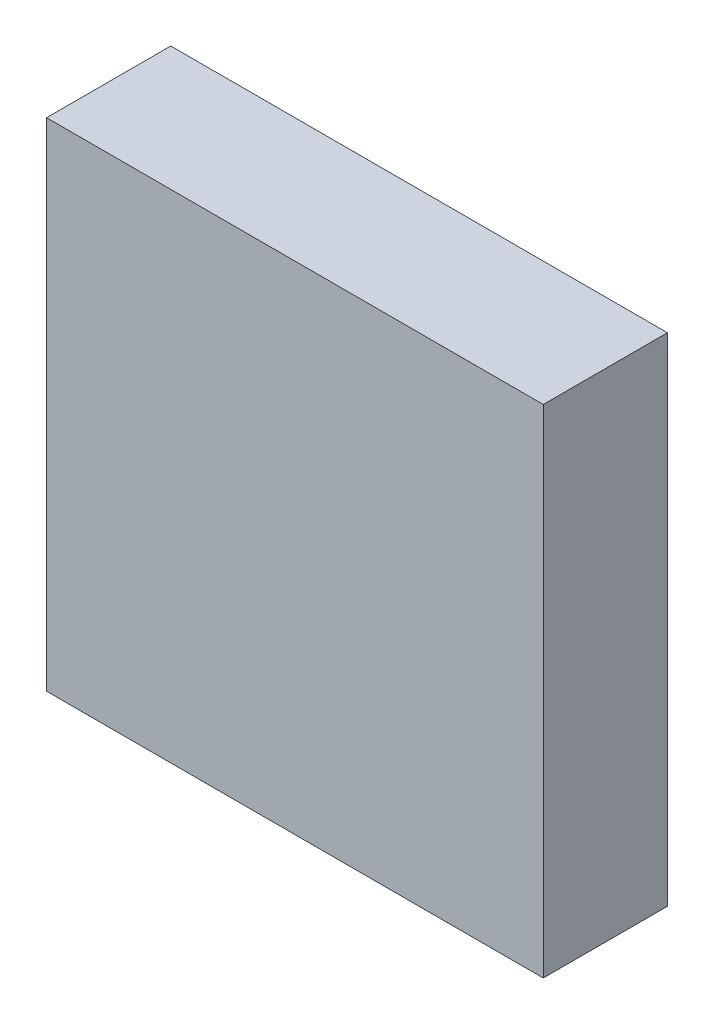
ISO-10303-21;
HEADER;
FILE_DESCRIPTION(('STEP AP214'),'2;1');
FILE_NAME('part.step','',(''),(''),'','','');
FILE_SCHEMA(('AUTOMOTIVE_DESIGN { 1 0 10303 214 1 1 1 1 }'));
ENDSEC;
DATA;
#1=APPLICATION_CONTEXT('core data for automotive mechanical design processes');
#2=APPLICATION_PROTOCOL_DEFINITION('international standard','automotive_design',2000,#1);
#3=PRODUCT_CONTEXT('',#1,'mechanical');
#4=PRODUCT('Part','Part','',(#3));
#5=PRODUCT_RELATED_PRODUCT_CATEGORY('part','',(#4));
#6=PRODUCT_DEFINITION_FORMATION('','',#4);
#7=PRODUCT_DEFINITION_CONTEXT('part definition',#1,'design');
#8=PRODUCT_DEFINITION('design','',#6,#7);
#9=PRODUCT_DEFINITION_SHAPE('','',#8);
#10=(LENGTH_UNIT() NAMED_UNIT(*) SI_UNIT(.MILLI.,.METRE.));
#11=(NAMED_UNIT(*) PLANE_ANGLE_UNIT() SI_UNIT($,.RADIAN.));
#12=(NAMED_UNIT(*) SI_UNIT($,.STERADIAN.) SOLID_ANGLE_UNIT());
#13=UNCERTAINTY_MEASURE_WITH_UNIT(LENGTH_MEASURE(1.E-05),#10,'distance_accuracy_value','');
#14=(GEOMETRIC_REPRESENTATION_CONTEXT(3) GLOBAL_UNCERTAINTY_ASSIGNED_CONTEXT((#13)) GLOBAL_UNIT_ASSIGNED_CONTEXT((#10,
#11,#12)) REPRESENTATION_CONTEXT('',''));
#15=CARTESIAN_POINT('',(0.,0.,0.));
#16=DIRECTION('',(0.,0.,1.));
#17=DIRECTION('',(1.,0.,0.));
#18=AXIS2_PLACEMENT_3D('',#15,#16,#17);
#19=CARTESIAN_POINT('',(0.,0.,30.));
#20=DIRECTION('',(1.,0.,0.));
#21=DIRECTION('',(0.,1.,0.));
#22=AXIS2_PLACEMENT_3D('',#19,#20,#21);
#23=PLANE('',#22);
#24=DIRECTION('',(0.,-1.,0.));
#25=VECTOR('',#24,1.);
#26=CARTESIAN_POINT('',(0.,0.,0.));
#27=LINE('',#26,#25);
#28=CARTESIAN_POINT('',(0.,120.,0.));
#29=VERTEX_POINT('',#28);
#30=CARTESIAN_POINT('',(0.,0.,0.));
#31=VERTEX_POINT('',#30);
#32=EDGE_CURVE('E115',#29,#31,#27,.T.);
#33=ORIENTED_EDGE('',*,*,#32,.T.);
#34=DIRECTION('',(0.,0.,-1.));
#35=VECTOR('',#34,1.);
#36=CARTESIAN_POINT('',(0.,0.,30.));
#37=LINE('',#36,#35);
#38=CARTESIAN_POINT('',(0.,0.,30.));
#39=VERTEX_POINT('',#38);
#40=EDGE_CURVE('E11',#39,#31,#37,.T.);
#41=ORIENTED_EDGE('',*,*,#40,.F.);
#42=DIRECTION('',(0.,-1.,0.));
#43=VECTOR('',#42,1.);
#44=CARTESIAN_POINT('',(0.,0.,30.));
#45=LINE('',#44,#43);
#46=CARTESIAN_POINT('',(0.,120.,30.));
#47=VERTEX_POINT('',#46);
#48=EDGE_CURVE('E91',#47,#39,#45,.T.);
#49=ORIENTED_EDGE('',*,*,#48,.F.);
#50=DIRECTION('',(0.,0.,-1.));
#51=VECTOR('',#50,1.);
#52=CARTESIAN_POINT('',(0.,120.,30.));
#53=LINE('',#52,#51);
#54=EDGE_CURVE('E107',#47,#29,#53,.T.);
#55=ORIENTED_EDGE('',*,*,#54,.T.);
#56=EDGE_LOOP('',(#33,#41,#49,#55));
#57=FACE_BOUND('',#56,.T.);
#58=ADVANCED_FACE('F41',(#57),#23,.F.);
#59=CARTESIAN_POINT('',(0.,0.,30.));
#60=DIRECTION('',(0.,1.,0.));
#61=DIRECTION('',(0.,0.,1.));
#62=AXIS2_PLACEMENT_3D('',#59,#60,#61);
#63=PLANE('',#62);
#64=DIRECTION('',(1.,0.,0.));
#65=VECTOR('',#64,1.);
#66=CARTESIAN_POINT('',(0.,0.,0.));
#67=LINE('',#66,#65);
#68=CARTESIAN_POINT('',(120.,0.,0.));
#69=VERTEX_POINT('',#68);
#70=EDGE_CURVE('E98',#31,#69,#67,.T.);
#71=ORIENTED_EDGE('',*,*,#70,.T.);
#72=DIRECTION('',(0.,0.,-1.));
#73=VECTOR('',#72,1.);
#74=CARTESIAN_POINT('',(120.,0.,30.));
#75=LINE('',#74,#73);
#76=CARTESIAN_POINT('',(120.,0.,30.));
#77=VERTEX_POINT('',#76);
#78=EDGE_CURVE('E49',#77,#69,#75,.T.);
#79=ORIENTED_EDGE('',*,*,#78,.F.);
#80=DIRECTION('',(1.,0.,0.));
#81=VECTOR('',#80,1.);
#82=CARTESIAN_POINT('',(0.,0.,30.));
#83=LINE('',#82,#81);
#84=EDGE_CURVE('E86',#39,#77,#83,.T.);
#85=ORIENTED_EDGE('',*,*,#84,.F.);
#86=ORIENTED_EDGE('',*,*,#40,.T.);
#87=EDGE_LOOP('',(#71,#79,#85,#86));
#88=FACE_BOUND('',#87,.T.);
#89=ADVANCED_FACE('F100',(#88),#63,.F.);
#90=CARTESIAN_POINT('',(120.,0.,30.));
#91=DIRECTION('',(-1.,0.,0.));
#92=DIRECTION('',(0.,-1.,0.));
#93=AXIS2_PLACEMENT_3D('',#90,#91,#92);
#94=PLANE('',#93);
#95=DIRECTION('',(0.,1.,0.));
#96=VECTOR('',#95,1.);
#97=CARTESIAN_POINT('',(120.,0.,0.));
#98=LINE('',#97,#96);
#99=CARTESIAN_POINT('',(120.,120.,0.));
#100=VERTEX_POINT('',#99);
#101=EDGE_CURVE('E73',#69,#100,#98,.T.);
#102=ORIENTED_EDGE('',*,*,#101,.T.);
#103=DIRECTION('',(0.,0.,-1.));
#104=VECTOR('',#103,1.);
#105=CARTESIAN_POINT('',(120.,120.,30.));
#106=LINE('',#105,#104);
#107=CARTESIAN_POINT('',(120.,120.,30.));
#108=VERTEX_POINT('',#107);
#109=EDGE_CURVE('E99',#108,#100,#106,.T.);
#110=ORIENTED_EDGE('',*,*,#109,.F.);
#111=DIRECTION('',(0.,1.,0.));
#112=VECTOR('',#111,1.);
#113=CARTESIAN_POINT('',(120.,0.,30.));
#114=LINE('',#113,#112);
#115=EDGE_CURVE('E93',#77,#108,#114,.T.);
#116=ORIENTED_EDGE('',*,*,#115,.F.);
#117=ORIENTED_EDGE('',*,*,#78,.T.);
#118=EDGE_LOOP('',(#102,#110,#116,#117));
#119=FACE_BOUND('',#118,.T.);
#120=ADVANCED_FACE('F101',(#119),#94,.F.);
#121=CARTESIAN_POINT('',(0.,120.,30.));
#122=DIRECTION('',(0.,-1.,0.));
#123=DIRECTION('',(0.,0.,-1.));
#124=AXIS2_PLACEMENT_3D('',#121,#122,#123);
#125=PLANE('',#124);
#126=DIRECTION('',(-1.,0.,0.));
#127=VECTOR('',#126,1.);
#128=CARTESIAN_POINT('',(0.,120.,0.));
#129=LINE('',#128,#127);
#130=EDGE_CURVE('E82',#100,#29,#129,.T.);
#131=ORIENTED_EDGE('',*,*,#130,.T.);
#132=ORIENTED_EDGE('',*,*,#54,.F.);
#133=DIRECTION('',(-1.,0.,0.));
#134=VECTOR('',#133,1.);
#135=CARTESIAN_POINT('',(0.,120.,30.));
#136=LINE('',#135,#134);
#137=EDGE_CURVE('E59',#108,#47,#136,.T.);
#138=ORIENTED_EDGE('',*,*,#137,.F.);
#139=ORIENTED_EDGE('',*,*,#109,.T.);
#140=EDGE_LOOP('',(#131,#132,#138,#139));
#141=FACE_BOUND('',#140,.T.);
#142=ADVANCED_FACE('F124',(#141),#125,.F.);
#143=CARTESIAN_POINT('',(0.,120.,30.));
#144=DIRECTION('',(0.,0.,-1.));
#145=DIRECTION('',(-1.,0.,0.));
#146=AXIS2_PLACEMENT_3D('',#143,#144,#145);
#147=PLANE('',#146);
#148=ORIENTED_EDGE('',*,*,#48,.T.);
#149=ORIENTED_EDGE('',*,*,#84,.T.);
#150=ORIENTED_EDGE('',*,*,#115,.T.);
#151=ORIENTED_EDGE('',*,*,#137,.T.);
#152=EDGE_LOOP('',(#148,#149,#150,#151));
#153=FACE_BOUND('',#152,.T.);
#154=ADVANCED_FACE('F90',(#153),#147,.F.);
#155=CARTESIAN_POINT('',(0.,120.,0.));
#156=DIRECTION('',(0.,0.,-1.));
#157=DIRECTION('',(-1.,0.,0.));
#158=AXIS2_PLACEMENT_3D('',#155,#156,#157);
#159=PLANE('',#158);
#160=ORIENTED_EDGE('',*,*,#32,.F.);
#161=ORIENTED_EDGE('',*,*,#130,.F.);
#162=ORIENTED_EDGE('',*,*,#101,.F.);
#163=ORIENTED_EDGE('',*,*,#70,.F.);
#164=EDGE_LOOP('',(#160,#161,#162,#163));
#165=FACE_BOUND('',#164,.T.);
#166=ADVANCED_FACE('F130',(#165),#159,.T.);
#167=CLOSED_SHELL('',(#58,#89,#120,#142,#154,#166));
#168=MANIFOLD_SOLID_BREP('B2',#167);
#169=ADVANCED_BREP_SHAPE_REPRESENTATION('',(#18,#168),#14);
#170=SHAPE_DEFINITION_REPRESENTATION(#9,#169);
ENDSEC;
END-ISO-10303-21;
